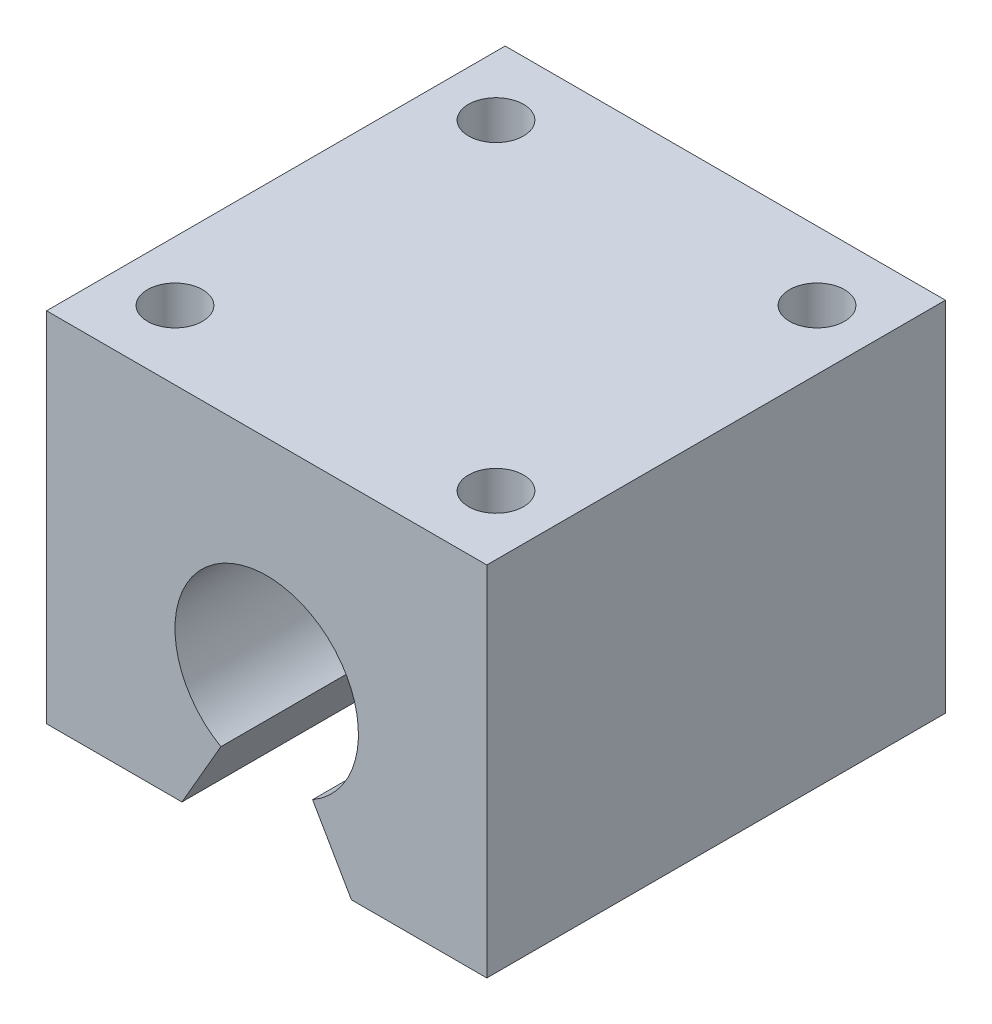
ISO-10303-21;
HEADER;
FILE_DESCRIPTION(('STEP AP214'),'2;1');
FILE_NAME('part.step','',(''),(''),'','','');
FILE_SCHEMA(('AUTOMOTIVE_DESIGN { 1 0 10303 214 1 1 1 1 }'));
ENDSEC;
DATA;
#1=APPLICATION_CONTEXT('core data for automotive mechanical design processes');
#2=APPLICATION_PROTOCOL_DEFINITION('international standard','automotive_design',2000,#1);
#3=PRODUCT_CONTEXT('',#1,'mechanical');
#4=PRODUCT('Part','Part','',(#3));
#5=PRODUCT_RELATED_PRODUCT_CATEGORY('part','',(#4));
#6=PRODUCT_DEFINITION_FORMATION('','',#4);
#7=PRODUCT_DEFINITION_CONTEXT('part definition',#1,'design');
#8=PRODUCT_DEFINITION('design','',#6,#7);
#9=PRODUCT_DEFINITION_SHAPE('','',#8);
#10=(LENGTH_UNIT() NAMED_UNIT(*) SI_UNIT(.MILLI.,.METRE.));
#11=(NAMED_UNIT(*) PLANE_ANGLE_UNIT() SI_UNIT($,.RADIAN.));
#12=(NAMED_UNIT(*) SI_UNIT($,.STERADIAN.) SOLID_ANGLE_UNIT());
#13=UNCERTAINTY_MEASURE_WITH_UNIT(LENGTH_MEASURE(1.E-05),#10,'distance_accuracy_value','');
#14=(GEOMETRIC_REPRESENTATION_CONTEXT(3) GLOBAL_UNCERTAINTY_ASSIGNED_CONTEXT((#13)) GLOBAL_UNIT_ASSIGNED_CONTEXT((#10,
#11,#12)) REPRESENTATION_CONTEXT('',''));
#15=CARTESIAN_POINT('',(0.,0.,0.));
#16=DIRECTION('',(0.,0.,1.));
#17=DIRECTION('',(1.,0.,0.));
#18=AXIS2_PLACEMENT_3D('',#15,#16,#17);
#19=CARTESIAN_POINT('',(9.23760430703404,-16.,25.));
#20=DIRECTION('',(0.,1.,0.));
#21=DIRECTION('',(-1.,0.,0.));
#22=AXIS2_PLACEMENT_3D('',#19,#20,#21);
#23=PLANE('',#22);
#24=DIRECTION('',(1.,0.,0.));
#25=VECTOR('',#24,1.);
#26=CARTESIAN_POINT('',(9.23760430703404,-16.,-25.));
#27=LINE('',#26,#25);
#28=CARTESIAN_POINT('',(9.23760430703404,-16.,-25.));
#29=VERTEX_POINT('',#28);
#30=CARTESIAN_POINT('',(24.,-16.,-25.));
#31=VERTEX_POINT('',#30);
#32=EDGE_CURVE('E128',#29,#31,#27,.T.);
#33=ORIENTED_EDGE('',*,*,#32,.T.);
#34=DIRECTION('',(0.,0.,-1.));
#35=VECTOR('',#34,1.);
#36=CARTESIAN_POINT('',(24.,-16.,25.));
#37=LINE('',#36,#35);
#38=CARTESIAN_POINT('',(24.,-16.,25.));
#39=VERTEX_POINT('',#38);
#40=EDGE_CURVE('E11',#39,#31,#37,.T.);
#41=ORIENTED_EDGE('',*,*,#40,.F.);
#42=DIRECTION('',(1.,0.,0.));
#43=VECTOR('',#42,1.);
#44=CARTESIAN_POINT('',(9.23760430703404,-16.,25.));
#45=LINE('',#44,#43);
#46=CARTESIAN_POINT('',(9.23760430703404,-16.,25.));
#47=VERTEX_POINT('',#46);
#48=EDGE_CURVE('E143',#47,#39,#45,.T.);
#49=ORIENTED_EDGE('',*,*,#48,.F.);
#50=DIRECTION('',(0.,0.,-1.));
#51=VECTOR('',#50,1.);
#52=CARTESIAN_POINT('',(9.23760430703404,-16.,25.));
#53=LINE('',#52,#51);
#54=EDGE_CURVE('E124',#47,#29,#53,.T.);
#55=ORIENTED_EDGE('',*,*,#54,.T.);
#56=EDGE_LOOP('',(#33,#41,#49,#55));
#57=FACE_BOUND('',#56,.T.);
#58=ADVANCED_FACE('F32',(#57),#23,.F.);
#59=CARTESIAN_POINT('',(24.,23.,25.));
#60=DIRECTION('',(-1.,0.,0.));
#61=DIRECTION('',(0.,-1.,0.));
#62=AXIS2_PLACEMENT_3D('',#59,#60,#61);
#63=PLANE('',#62);
#64=DIRECTION('',(0.,1.,0.));
#65=VECTOR('',#64,1.);
#66=CARTESIAN_POINT('',(24.,23.,-25.));
#67=LINE('',#66,#65);
#68=CARTESIAN_POINT('',(24.,23.,-25.));
#69=VERTEX_POINT('',#68);
#70=EDGE_CURVE('E131',#31,#69,#67,.T.);
#71=ORIENTED_EDGE('',*,*,#70,.T.);
#72=DIRECTION('',(0.,0.,-1.));
#73=VECTOR('',#72,1.);
#74=CARTESIAN_POINT('',(24.,23.,25.));
#75=LINE('',#74,#73);
#76=CARTESIAN_POINT('',(24.,23.,25.));
#77=VERTEX_POINT('',#76);
#78=EDGE_CURVE('E40',#77,#69,#75,.T.);
#79=ORIENTED_EDGE('',*,*,#78,.F.);
#80=DIRECTION('',(0.,1.,0.));
#81=VECTOR('',#80,1.);
#82=CARTESIAN_POINT('',(24.,23.,25.));
#83=LINE('',#82,#81);
#84=EDGE_CURVE('E91',#39,#77,#83,.T.);
#85=ORIENTED_EDGE('',*,*,#84,.F.);
#86=ORIENTED_EDGE('',*,*,#40,.T.);
#87=EDGE_LOOP('',(#71,#79,#85,#86));
#88=FACE_BOUND('',#87,.T.);
#89=ADVANCED_FACE('F211',(#88),#63,.F.);
#90=CARTESIAN_POINT('',(-24.,23.,25.));
#91=DIRECTION('',(0.,-1.,0.));
#92=DIRECTION('',(0.,0.,-1.));
#93=AXIS2_PLACEMENT_3D('',#90,#91,#92);
#94=PLANE('',#93);
#95=CARTESIAN_POINT('',(17.5,23.,-17.5));
#96=DIRECTION('',(0.,1.,0.));
#97=DIRECTION('',(0.,0.,1.));
#98=AXIS2_PLACEMENT_3D('',#95,#96,#97);
#99=CIRCLE('',#98,3.);
#100=CARTESIAN_POINT('',(17.5,23.,-14.5));
#101=VERTEX_POINT('',#100);
#102=EDGE_CURVE('E194',#101,#101,#99,.T.);
#103=ORIENTED_EDGE('',*,*,#102,.F.);
#104=EDGE_LOOP('',(#103));
#105=FACE_BOUND('',#104,.T.);
#106=CARTESIAN_POINT('',(17.5,23.,17.5));
#107=DIRECTION('',(0.,1.,0.));
#108=DIRECTION('',(0.,0.,1.));
#109=AXIS2_PLACEMENT_3D('',#106,#107,#108);
#110=CIRCLE('',#109,3.);
#111=CARTESIAN_POINT('',(17.5,23.,20.5));
#112=VERTEX_POINT('',#111);
#113=EDGE_CURVE('E188',#112,#112,#110,.T.);
#114=ORIENTED_EDGE('',*,*,#113,.F.);
#115=EDGE_LOOP('',(#114));
#116=FACE_BOUND('',#115,.T.);
#117=CARTESIAN_POINT('',(-17.5,23.,17.5));
#118=DIRECTION('',(0.,1.,0.));
#119=DIRECTION('',(0.,0.,1.));
#120=AXIS2_PLACEMENT_3D('',#117,#118,#119);
#121=CIRCLE('',#120,3.);
#122=CARTESIAN_POINT('',(-17.5,23.,20.5));
#123=VERTEX_POINT('',#122);
#124=EDGE_CURVE('E182',#123,#123,#121,.T.);
#125=ORIENTED_EDGE('',*,*,#124,.F.);
#126=EDGE_LOOP('',(#125));
#127=FACE_BOUND('',#126,.T.);
#128=CARTESIAN_POINT('',(-17.5,23.,-17.5));
#129=DIRECTION('',(0.,1.,0.));
#130=DIRECTION('',(0.,0.,1.));
#131=AXIS2_PLACEMENT_3D('',#128,#129,#130);
#132=CIRCLE('',#131,3.);
#133=CARTESIAN_POINT('',(-17.5,23.,-14.5));
#134=VERTEX_POINT('',#133);
#135=EDGE_CURVE('E176',#134,#134,#132,.T.);
#136=ORIENTED_EDGE('',*,*,#135,.F.);
#137=EDGE_LOOP('',(#136));
#138=FACE_BOUND('',#137,.T.);
#139=DIRECTION('',(-1.,0.,0.));
#140=VECTOR('',#139,1.);
#141=CARTESIAN_POINT('',(-24.,23.,-25.));
#142=LINE('',#141,#140);
#143=CARTESIAN_POINT('',(-24.,23.,-25.));
#144=VERTEX_POINT('',#143);
#145=EDGE_CURVE('E134',#69,#144,#142,.T.);
#146=ORIENTED_EDGE('',*,*,#145,.T.);
#147=DIRECTION('',(0.,0.,-1.));
#148=VECTOR('',#147,1.);
#149=CARTESIAN_POINT('',(-24.,23.,25.));
#150=LINE('',#149,#148);
#151=CARTESIAN_POINT('',(-24.,23.,25.));
#152=VERTEX_POINT('',#151);
#153=EDGE_CURVE('E150',#152,#144,#150,.T.);
#154=ORIENTED_EDGE('',*,*,#153,.F.);
#155=DIRECTION('',(-1.,0.,0.));
#156=VECTOR('',#155,1.);
#157=CARTESIAN_POINT('',(-24.,23.,25.));
#158=LINE('',#157,#156);
#159=EDGE_CURVE('E158',#77,#152,#158,.T.);
#160=ORIENTED_EDGE('',*,*,#159,.F.);
#161=ORIENTED_EDGE('',*,*,#78,.T.);
#162=EDGE_LOOP('',(#146,#154,#160,#161));
#163=FACE_BOUND('',#162,.T.);
#164=ADVANCED_FACE('F156',(#105,#116,#127,#138,#163),#94,.F.);
#165=CARTESIAN_POINT('',(-24.,23.,25.));
#166=DIRECTION('',(1.,0.,0.));
#167=DIRECTION('',(0.,1.,0.));
#168=AXIS2_PLACEMENT_3D('',#165,#166,#167);
#169=PLANE('',#168);
#170=DIRECTION('',(0.,-1.,0.));
#171=VECTOR('',#170,1.);
#172=CARTESIAN_POINT('',(-24.,23.,-25.));
#173=LINE('',#172,#171);
#174=CARTESIAN_POINT('',(-24.,-16.,-25.));
#175=VERTEX_POINT('',#174);
#176=EDGE_CURVE('E136',#144,#175,#173,.T.);
#177=ORIENTED_EDGE('',*,*,#176,.T.);
#178=DIRECTION('',(0.,0.,-1.));
#179=VECTOR('',#178,1.);
#180=CARTESIAN_POINT('',(-24.,-16.,25.));
#181=LINE('',#180,#179);
#182=CARTESIAN_POINT('',(-24.,-16.,25.));
#183=VERTEX_POINT('',#182);
#184=EDGE_CURVE('E147',#183,#175,#181,.T.);
#185=ORIENTED_EDGE('',*,*,#184,.F.);
#186=DIRECTION('',(0.,-1.,0.));
#187=VECTOR('',#186,1.);
#188=CARTESIAN_POINT('',(-24.,23.,25.));
#189=LINE('',#188,#187);
#190=EDGE_CURVE('E170',#152,#183,#189,.T.);
#191=ORIENTED_EDGE('',*,*,#190,.F.);
#192=ORIENTED_EDGE('',*,*,#153,.T.);
#193=EDGE_LOOP('',(#177,#185,#191,#192));
#194=FACE_BOUND('',#193,.T.);
#195=ADVANCED_FACE('F166',(#194),#169,.F.);
#196=CARTESIAN_POINT('',(-24.,-16.,25.));
#197=DIRECTION('',(0.,1.,0.));
#198=DIRECTION('',(-1.,0.,0.));
#199=AXIS2_PLACEMENT_3D('',#196,#197,#198);
#200=PLANE('',#199);
#201=DIRECTION('',(1.,0.,0.));
#202=VECTOR('',#201,1.);
#203=CARTESIAN_POINT('',(-24.,-16.,-25.));
#204=LINE('',#203,#202);
#205=CARTESIAN_POINT('',(-9.23760430703404,-16.,-25.));
#206=VERTEX_POINT('',#205);
#207=EDGE_CURVE('E138',#175,#206,#204,.T.);
#208=ORIENTED_EDGE('',*,*,#207,.T.);
#209=DIRECTION('',(0.,0.,-1.));
#210=VECTOR('',#209,1.);
#211=CARTESIAN_POINT('',(-9.23760430703404,-16.,25.));
#212=LINE('',#211,#210);
#213=CARTESIAN_POINT('',(-9.23760430703404,-16.,25.));
#214=VERTEX_POINT('',#213);
#215=EDGE_CURVE('E119',#214,#206,#212,.T.);
#216=ORIENTED_EDGE('',*,*,#215,.F.);
#217=DIRECTION('',(1.,0.,0.));
#218=VECTOR('',#217,1.);
#219=CARTESIAN_POINT('',(-24.,-16.,25.));
#220=LINE('',#219,#218);
#221=EDGE_CURVE('E110',#183,#214,#220,.T.);
#222=ORIENTED_EDGE('',*,*,#221,.F.);
#223=ORIENTED_EDGE('',*,*,#184,.T.);
#224=EDGE_LOOP('',(#208,#216,#222,#223));
#225=FACE_BOUND('',#224,.T.);
#226=ADVANCED_FACE('F169',(#225),#200,.F.);
#227=CARTESIAN_POINT('',(-5.00000000000001,-8.66025403784439,25.));
#228=DIRECTION('',(-0.866025403784438,0.500000000000001,0.));
#229=DIRECTION('',(-0.500000000000001,-0.866025403784438,0.));
#230=AXIS2_PLACEMENT_3D('',#227,#228,#229);
#231=PLANE('',#230);
#232=DIRECTION('',(0.500000000000001,0.866025403784438,0.));
#233=VECTOR('',#232,1.);
#234=CARTESIAN_POINT('',(-5.00000000000001,-8.66025403784439,-25.));
#235=LINE('',#234,#233);
#236=CARTESIAN_POINT('',(-5.00000000000001,-8.66025403784439,-25.));
#237=VERTEX_POINT('',#236);
#238=EDGE_CURVE('E118',#206,#237,#235,.T.);
#239=ORIENTED_EDGE('',*,*,#238,.T.);
#240=DIRECTION('',(0.,0.,-1.));
#241=VECTOR('',#240,1.);
#242=CARTESIAN_POINT('',(-5.00000000000001,-8.66025403784439,25.));
#243=LINE('',#242,#241);
#244=CARTESIAN_POINT('',(-5.00000000000001,-8.66025403784439,25.));
#245=VERTEX_POINT('',#244);
#246=EDGE_CURVE('E115',#245,#237,#243,.T.);
#247=ORIENTED_EDGE('',*,*,#246,.F.);
#248=DIRECTION('',(0.500000000000001,0.866025403784438,0.));
#249=VECTOR('',#248,1.);
#250=CARTESIAN_POINT('',(-5.00000000000001,-8.66025403784439,25.));
#251=LINE('',#250,#249);
#252=EDGE_CURVE('E104',#214,#245,#251,.T.);
#253=ORIENTED_EDGE('',*,*,#252,.F.);
#254=ORIENTED_EDGE('',*,*,#215,.T.);
#255=EDGE_LOOP('',(#239,#247,#253,#254));
#256=FACE_BOUND('',#255,.T.);
#257=ADVANCED_FACE('F116',(#256),#231,.F.);
#258=CARTESIAN_POINT('',(0.,0.,25.));
#259=DIRECTION('',(0.,0.,-1.));
#260=DIRECTION('',(-1.,0.,0.));
#261=AXIS2_PLACEMENT_3D('',#258,#259,#260);
#262=CYLINDRICAL_SURFACE('',#261,10.);
#263=CARTESIAN_POINT('',(0.,0.,-25.));
#264=DIRECTION('',(0.,0.,-1.));
#265=DIRECTION('',(1.,0.,0.));
#266=AXIS2_PLACEMENT_3D('',#263,#264,#265);
#267=CIRCLE('',#266,10.);
#268=CARTESIAN_POINT('',(5.00000000000001,-8.66025403784438,-25.));
#269=VERTEX_POINT('',#268);
#270=EDGE_CURVE('E77',#237,#269,#267,.T.);
#271=ORIENTED_EDGE('',*,*,#270,.T.);
#272=DIRECTION('',(0.,0.,-1.));
#273=VECTOR('',#272,1.);
#274=CARTESIAN_POINT('',(5.00000000000001,-8.66025403784438,25.));
#275=LINE('',#274,#273);
#276=CARTESIAN_POINT('',(5.00000000000001,-8.66025403784438,25.));
#277=VERTEX_POINT('',#276);
#278=EDGE_CURVE('E120',#277,#269,#275,.T.);
#279=ORIENTED_EDGE('',*,*,#278,.F.);
#280=CARTESIAN_POINT('',(0.,0.,25.));
#281=DIRECTION('',(0.,0.,-1.));
#282=DIRECTION('',(1.,0.,0.));
#283=AXIS2_PLACEMENT_3D('',#280,#281,#282);
#284=CIRCLE('',#283,10.);
#285=EDGE_CURVE('E108',#245,#277,#284,.T.);
#286=ORIENTED_EDGE('',*,*,#285,.F.);
#287=ORIENTED_EDGE('',*,*,#246,.T.);
#288=EDGE_LOOP('',(#271,#279,#286,#287));
#289=FACE_BOUND('',#288,.T.);
#290=ADVANCED_FACE('F122',(#289),#262,.F.);
#291=CARTESIAN_POINT('',(5.00000000000002,-8.66025403784438,25.));
#292=DIRECTION('',(0.866025403784438,0.500000000000001,0.));
#293=DIRECTION('',(-0.500000000000001,0.866025403784438,0.));
#294=AXIS2_PLACEMENT_3D('',#291,#292,#293);
#295=PLANE('',#294);
#296=DIRECTION('',(0.500000000000001,-0.866025403784438,0.));
#297=VECTOR('',#296,1.);
#298=CARTESIAN_POINT('',(5.00000000000002,-8.66025403784438,-25.));
#299=LINE('',#298,#297);
#300=EDGE_CURVE('E83',#269,#29,#299,.T.);
#301=ORIENTED_EDGE('',*,*,#300,.T.);
#302=ORIENTED_EDGE('',*,*,#54,.F.);
#303=DIRECTION('',(0.500000000000001,-0.866025403784438,0.));
#304=VECTOR('',#303,1.);
#305=CARTESIAN_POINT('',(5.00000000000002,-8.66025403784438,25.));
#306=LINE('',#305,#304);
#307=EDGE_CURVE('E48',#277,#47,#306,.T.);
#308=ORIENTED_EDGE('',*,*,#307,.F.);
#309=ORIENTED_EDGE('',*,*,#278,.T.);
#310=EDGE_LOOP('',(#301,#302,#308,#309));
#311=FACE_BOUND('',#310,.T.);
#312=ADVANCED_FACE('F241',(#311),#295,.F.);
#313=CARTESIAN_POINT('',(0.,0.,25.));
#314=DIRECTION('',(0.,0.,1.));
#315=DIRECTION('',(1.,0.,0.));
#316=AXIS2_PLACEMENT_3D('',#313,#314,#315);
#317=PLANE('',#316);
#318=ORIENTED_EDGE('',*,*,#48,.T.);
#319=ORIENTED_EDGE('',*,*,#84,.T.);
#320=ORIENTED_EDGE('',*,*,#159,.T.);
#321=ORIENTED_EDGE('',*,*,#190,.T.);
#322=ORIENTED_EDGE('',*,*,#221,.T.);
#323=ORIENTED_EDGE('',*,*,#252,.T.);
#324=ORIENTED_EDGE('',*,*,#285,.T.);
#325=ORIENTED_EDGE('',*,*,#307,.T.);
#326=EDGE_LOOP('',(#318,#319,#320,#321,#322,#323,#324,#325));
#327=FACE_BOUND('',#326,.T.);
#328=ADVANCED_FACE('F106',(#327),#317,.T.);
#329=CARTESIAN_POINT('',(0.,0.,-25.));
#330=DIRECTION('',(0.,0.,1.));
#331=DIRECTION('',(1.,0.,0.));
#332=AXIS2_PLACEMENT_3D('',#329,#330,#331);
#333=PLANE('',#332);
#334=ORIENTED_EDGE('',*,*,#32,.F.);
#335=ORIENTED_EDGE('',*,*,#300,.F.);
#336=ORIENTED_EDGE('',*,*,#270,.F.);
#337=ORIENTED_EDGE('',*,*,#238,.F.);
#338=ORIENTED_EDGE('',*,*,#207,.F.);
#339=ORIENTED_EDGE('',*,*,#176,.F.);
#340=ORIENTED_EDGE('',*,*,#145,.F.);
#341=ORIENTED_EDGE('',*,*,#70,.F.);
#342=EDGE_LOOP('',(#334,#335,#336,#337,#338,#339,#340,#341));
#343=FACE_BOUND('',#342,.T.);
#344=ADVANCED_FACE('F162',(#343),#333,.F.);
#345=CARTESIAN_POINT('',(-17.5,12.,-17.5));
#346=DIRECTION('',(0.,1.,0.));
#347=DIRECTION('',(0.,0.,1.));
#348=AXIS2_PLACEMENT_3D('',#345,#346,#347);
#349=CYLINDRICAL_SURFACE('',#348,3.);
#350=CARTESIAN_POINT('',(-17.5,12.,-17.5));
#351=DIRECTION('',(0.,1.,0.));
#352=DIRECTION('',(0.,0.,1.));
#353=AXIS2_PLACEMENT_3D('',#350,#351,#352);
#354=CIRCLE('',#353,3.);
#355=CARTESIAN_POINT('',(-17.5,12.,-14.5));
#356=VERTEX_POINT('',#355);
#357=EDGE_CURVE('E132',#356,#356,#354,.T.);
#358=ORIENTED_EDGE('',*,*,#357,.F.);
#359=EDGE_LOOP('',(#358));
#360=FACE_BOUND('',#359,.T.);
#361=ORIENTED_EDGE('',*,*,#135,.T.);
#362=EDGE_LOOP('',(#361));
#363=FACE_BOUND('',#362,.T.);
#364=ADVANCED_FACE('F219',(#360,#363),#349,.F.);
#365=CARTESIAN_POINT('',(-17.5,12.,-17.5));
#366=DIRECTION('',(0.,1.,0.));
#367=DIRECTION('',(0.,0.,1.));
#368=AXIS2_PLACEMENT_3D('',#365,#366,#367);
#369=PLANE('',#368);
#370=ORIENTED_EDGE('',*,*,#357,.T.);
#371=EDGE_LOOP('',(#370));
#372=FACE_BOUND('',#371,.T.);
#373=ADVANCED_FACE('F221',(#372),#369,.T.);
#374=CARTESIAN_POINT('',(-17.5,12.,17.5));
#375=DIRECTION('',(0.,1.,0.));
#376=DIRECTION('',(0.,0.,1.));
#377=AXIS2_PLACEMENT_3D('',#374,#375,#376);
#378=CYLINDRICAL_SURFACE('',#377,3.);
#379=CARTESIAN_POINT('',(-17.5,12.,17.5));
#380=DIRECTION('',(0.,1.,0.));
#381=DIRECTION('',(0.,0.,1.));
#382=AXIS2_PLACEMENT_3D('',#379,#380,#381);
#383=CIRCLE('',#382,3.);
#384=CARTESIAN_POINT('',(-17.5,12.,20.5));
#385=VERTEX_POINT('',#384);
#386=EDGE_CURVE('E185',#385,#385,#383,.T.);
#387=ORIENTED_EDGE('',*,*,#386,.F.);
#388=EDGE_LOOP('',(#387));
#389=FACE_BOUND('',#388,.T.);
#390=ORIENTED_EDGE('',*,*,#124,.T.);
#391=EDGE_LOOP('',(#390));
#392=FACE_BOUND('',#391,.T.);
#393=ADVANCED_FACE('F228',(#389,#392),#378,.F.);
#394=CARTESIAN_POINT('',(-17.5,12.,17.5));
#395=DIRECTION('',(0.,1.,0.));
#396=DIRECTION('',(0.,0.,1.));
#397=AXIS2_PLACEMENT_3D('',#394,#395,#396);
#398=PLANE('',#397);
#399=ORIENTED_EDGE('',*,*,#386,.T.);
#400=EDGE_LOOP('',(#399));
#401=FACE_BOUND('',#400,.T.);
#402=ADVANCED_FACE('F312',(#401),#398,.T.);
#403=CARTESIAN_POINT('',(17.5,12.,17.5));
#404=DIRECTION('',(0.,1.,0.));
#405=DIRECTION('',(0.,0.,1.));
#406=AXIS2_PLACEMENT_3D('',#403,#404,#405);
#407=CYLINDRICAL_SURFACE('',#406,3.);
#408=CARTESIAN_POINT('',(17.5,12.,17.5));
#409=DIRECTION('',(0.,1.,0.));
#410=DIRECTION('',(0.,0.,1.));
#411=AXIS2_PLACEMENT_3D('',#408,#409,#410);
#412=CIRCLE('',#411,3.);
#413=CARTESIAN_POINT('',(17.5,12.,20.5));
#414=VERTEX_POINT('',#413);
#415=EDGE_CURVE('E191',#414,#414,#412,.T.);
#416=ORIENTED_EDGE('',*,*,#415,.F.);
#417=EDGE_LOOP('',(#416));
#418=FACE_BOUND('',#417,.T.);
#419=ORIENTED_EDGE('',*,*,#113,.T.);
#420=EDGE_LOOP('',(#419));
#421=FACE_BOUND('',#420,.T.);
#422=ADVANCED_FACE('F322',(#418,#421),#407,.F.);
#423=CARTESIAN_POINT('',(17.5,12.,17.5));
#424=DIRECTION('',(0.,1.,0.));
#425=DIRECTION('',(0.,0.,1.));
#426=AXIS2_PLACEMENT_3D('',#423,#424,#425);
#427=PLANE('',#426);
#428=ORIENTED_EDGE('',*,*,#415,.T.);
#429=EDGE_LOOP('',(#428));
#430=FACE_BOUND('',#429,.T.);
#431=ADVANCED_FACE('F205',(#430),#427,.T.);
#432=CARTESIAN_POINT('',(17.5,12.,-17.5));
#433=DIRECTION('',(0.,1.,0.));
#434=DIRECTION('',(0.,0.,1.));
#435=AXIS2_PLACEMENT_3D('',#432,#433,#434);
#436=CYLINDRICAL_SURFACE('',#435,3.);
#437=CARTESIAN_POINT('',(17.5,12.,-17.5));
#438=DIRECTION('',(0.,1.,0.));
#439=DIRECTION('',(0.,0.,1.));
#440=AXIS2_PLACEMENT_3D('',#437,#438,#439);
#441=CIRCLE('',#440,3.);
#442=CARTESIAN_POINT('',(17.5,12.,-14.5));
#443=VERTEX_POINT('',#442);
#444=EDGE_CURVE('E179',#443,#443,#441,.T.);
#445=ORIENTED_EDGE('',*,*,#444,.F.);
#446=EDGE_LOOP('',(#445));
#447=FACE_BOUND('',#446,.T.);
#448=ORIENTED_EDGE('',*,*,#102,.T.);
#449=EDGE_LOOP('',(#448));
#450=FACE_BOUND('',#449,.T.);
#451=ADVANCED_FACE('F202',(#447,#450),#436,.F.);
#452=CARTESIAN_POINT('',(17.5,12.,-17.5));
#453=DIRECTION('',(0.,1.,0.));
#454=DIRECTION('',(0.,0.,1.));
#455=AXIS2_PLACEMENT_3D('',#452,#453,#454);
#456=PLANE('',#455);
#457=ORIENTED_EDGE('',*,*,#444,.T.);
#458=EDGE_LOOP('',(#457));
#459=FACE_BOUND('',#458,.T.);
#460=ADVANCED_FACE('F200',(#459),#456,.T.);
#461=CLOSED_SHELL('',(#58,#89,#164,#195,#226,#257,#290,#312,#328,#344,#364,#373,#393,#402,#422,
#431,#451,#460));
#462=MANIFOLD_SOLID_BREP('B2',#461);
#463=ADVANCED_BREP_SHAPE_REPRESENTATION('',(#18,#462),#14);
#464=SHAPE_DEFINITION_REPRESENTATION(#9,#463);
ENDSEC;
END-ISO-10303-21;
